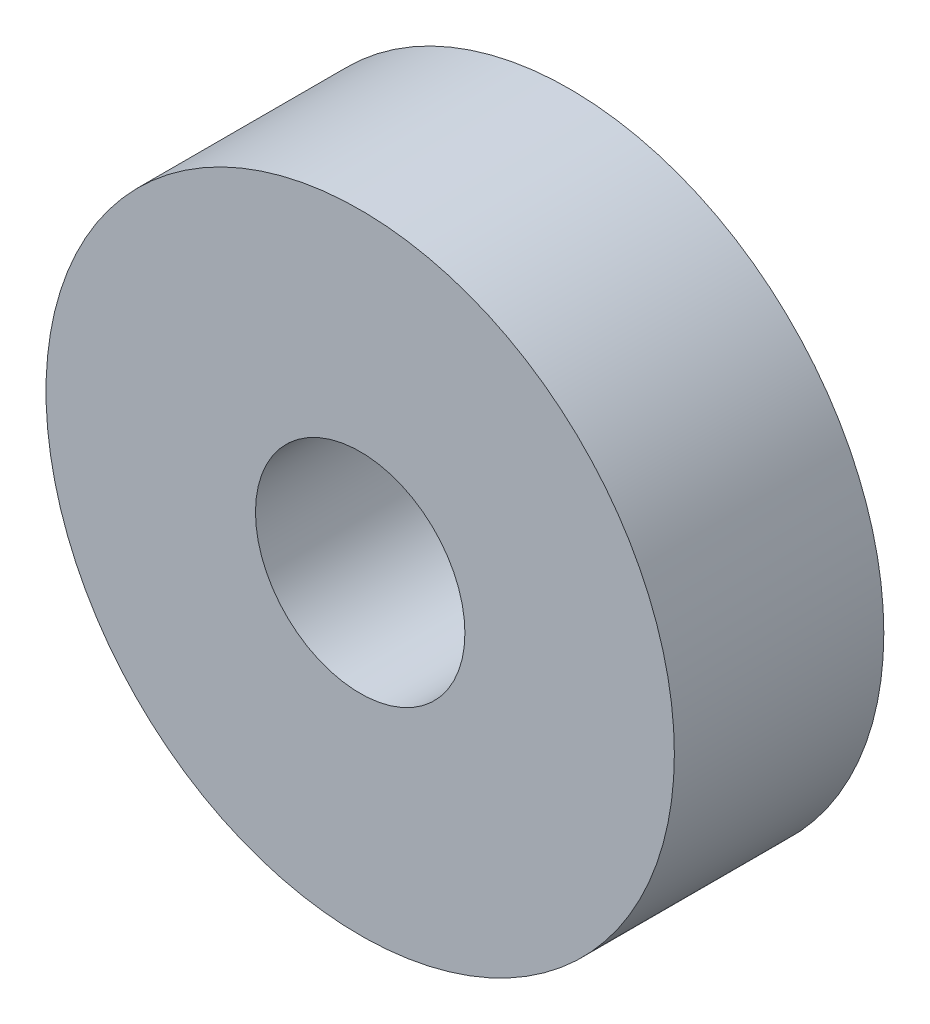
ISO-10303-21;
HEADER;
FILE_DESCRIPTION(('STEP AP214'),'2;1');
FILE_NAME('part.step','',(''),(''),'','','');
FILE_SCHEMA(('AUTOMOTIVE_DESIGN { 1 0 10303 214 1 1 1 1 }'));
ENDSEC;
DATA;
#1=APPLICATION_CONTEXT('core data for automotive mechanical design processes');
#2=APPLICATION_PROTOCOL_DEFINITION('international standard','automotive_design',2000,#1);
#3=PRODUCT_CONTEXT('',#1,'mechanical');
#4=PRODUCT('Part','Part','',(#3));
#5=PRODUCT_RELATED_PRODUCT_CATEGORY('part','',(#4));
#6=PRODUCT_DEFINITION_FORMATION('','',#4);
#7=PRODUCT_DEFINITION_CONTEXT('part definition',#1,'design');
#8=PRODUCT_DEFINITION('design','',#6,#7);
#9=PRODUCT_DEFINITION_SHAPE('','',#8);
#10=(LENGTH_UNIT() NAMED_UNIT(*) SI_UNIT(.MILLI.,.METRE.));
#11=(NAMED_UNIT(*) PLANE_ANGLE_UNIT() SI_UNIT($,.RADIAN.));
#12=(NAMED_UNIT(*) SI_UNIT($,.STERADIAN.) SOLID_ANGLE_UNIT());
#13=UNCERTAINTY_MEASURE_WITH_UNIT(LENGTH_MEASURE(1.E-05),#10,'distance_accuracy_value','');
#14=(GEOMETRIC_REPRESENTATION_CONTEXT(3) GLOBAL_UNCERTAINTY_ASSIGNED_CONTEXT((#13)) GLOBAL_UNIT_ASSIGNED_CONTEXT((#10,
#11,#12)) REPRESENTATION_CONTEXT('',''));
#15=CARTESIAN_POINT('',(0.,0.,0.));
#16=DIRECTION('',(0.,0.,1.));
#17=DIRECTION('',(1.,0.,0.));
#18=AXIS2_PLACEMENT_3D('',#15,#16,#17);
#19=CARTESIAN_POINT('',(0.,0.,1.));
#20=DIRECTION('',(0.,0.,1.));
#21=DIRECTION('',(1.,0.,0.));
#22=AXIS2_PLACEMENT_3D('',#19,#20,#21);
#23=PLANE('',#22);
#24=CARTESIAN_POINT('',(0.,0.,1.));
#25=DIRECTION('',(0.,0.,1.));
#26=DIRECTION('',(1.,0.,0.));
#27=AXIS2_PLACEMENT_3D('',#24,#25,#26);
#28=CIRCLE('',#27,1.5);
#29=CARTESIAN_POINT('',(1.5,0.,1.));
#30=VERTEX_POINT('',#29);
#31=EDGE_CURVE('E10',#30,#30,#28,.T.);
#32=ORIENTED_EDGE('',*,*,#31,.T.);
#33=EDGE_LOOP('',(#32));
#34=FACE_BOUND('',#33,.T.);
#35=CARTESIAN_POINT('',(0.,0.,1.));
#36=DIRECTION('',(0.,0.,1.));
#37=DIRECTION('',(1.,0.,0.));
#38=AXIS2_PLACEMENT_3D('',#35,#36,#37);
#39=CIRCLE('',#38,0.5);
#40=CARTESIAN_POINT('',(0.5,0.,1.));
#41=VERTEX_POINT('',#40);
#42=EDGE_CURVE('E46',#41,#41,#39,.T.);
#43=ORIENTED_EDGE('',*,*,#42,.F.);
#44=EDGE_LOOP('',(#43));
#45=FACE_BOUND('',#44,.T.);
#46=ADVANCED_FACE('F35',(#34,#45),#23,.T.);
#47=CARTESIAN_POINT('',(0.,0.,0.));
#48=DIRECTION('',(0.,0.,1.));
#49=DIRECTION('',(1.,0.,0.));
#50=AXIS2_PLACEMENT_3D('',#47,#48,#49);
#51=PLANE('',#50);
#52=CARTESIAN_POINT('',(0.,0.,0.));
#53=DIRECTION('',(0.,0.,1.));
#54=DIRECTION('',(1.,0.,0.));
#55=AXIS2_PLACEMENT_3D('',#52,#53,#54);
#56=CIRCLE('',#55,1.5);
#57=CARTESIAN_POINT('',(1.5,0.,0.));
#58=VERTEX_POINT('',#57);
#59=EDGE_CURVE('E39',#58,#58,#56,.T.);
#60=ORIENTED_EDGE('',*,*,#59,.F.);
#61=EDGE_LOOP('',(#60));
#62=FACE_BOUND('',#61,.T.);
#63=CARTESIAN_POINT('',(0.,0.,0.));
#64=DIRECTION('',(0.,0.,1.));
#65=DIRECTION('',(1.,0.,0.));
#66=AXIS2_PLACEMENT_3D('',#63,#64,#65);
#67=CIRCLE('',#66,0.5);
#68=CARTESIAN_POINT('',(0.5,0.,0.));
#69=VERTEX_POINT('',#68);
#70=EDGE_CURVE('E48',#69,#69,#67,.T.);
#71=ORIENTED_EDGE('',*,*,#70,.T.);
#72=EDGE_LOOP('',(#71));
#73=FACE_BOUND('',#72,.T.);
#74=ADVANCED_FACE('F58',(#62,#73),#51,.F.);
#75=CARTESIAN_POINT('',(0.,0.,1.));
#76=DIRECTION('',(0.,0.,-1.));
#77=DIRECTION('',(-1.,0.,0.));
#78=AXIS2_PLACEMENT_3D('',#75,#76,#77);
#79=CYLINDRICAL_SURFACE('',#78,1.5);
#80=ORIENTED_EDGE('',*,*,#31,.F.);
#81=EDGE_LOOP('',(#80));
#82=FACE_BOUND('',#81,.T.);
#83=ORIENTED_EDGE('',*,*,#59,.T.);
#84=EDGE_LOOP('',(#83));
#85=FACE_BOUND('',#84,.T.);
#86=ADVANCED_FACE('F37',(#82,#85),#79,.T.);
#87=CARTESIAN_POINT('',(0.,0.,1.));
#88=DIRECTION('',(0.,0.,-1.));
#89=DIRECTION('',(-1.,0.,0.));
#90=AXIS2_PLACEMENT_3D('',#87,#88,#89);
#91=CYLINDRICAL_SURFACE('',#90,0.5);
#92=ORIENTED_EDGE('',*,*,#42,.T.);
#93=EDGE_LOOP('',(#92));
#94=FACE_BOUND('',#93,.T.);
#95=ORIENTED_EDGE('',*,*,#70,.F.);
#96=EDGE_LOOP('',(#95));
#97=FACE_BOUND('',#96,.T.);
#98=ADVANCED_FACE('F54',(#94,#97),#91,.F.);
#99=CLOSED_SHELL('',(#46,#74,#86,#98));
#100=MANIFOLD_SOLID_BREP('B2',#99);
#101=ADVANCED_BREP_SHAPE_REPRESENTATION('',(#18,#100),#14);
#102=SHAPE_DEFINITION_REPRESENTATION(#9,#101);
ENDSEC;
END-ISO-10303-21;
